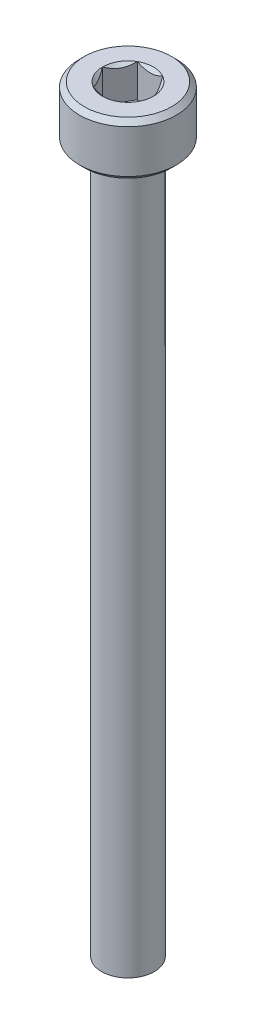
ISO-10303-21;
HEADER;
FILE_DESCRIPTION(('STEP AP214'),'2;1');
FILE_NAME('part.step','',(''),(''),'','','');
FILE_SCHEMA(('AUTOMOTIVE_DESIGN { 1 0 10303 214 1 1 1 1 }'));
ENDSEC;
DATA;
#1=APPLICATION_CONTEXT('core data for automotive mechanical design processes');
#2=APPLICATION_PROTOCOL_DEFINITION('international standard','automotive_design',2000,#1);
#3=PRODUCT_CONTEXT('',#1,'mechanical');
#4=PRODUCT('Part','Part','',(#3));
#5=PRODUCT_RELATED_PRODUCT_CATEGORY('part','',(#4));
#6=PRODUCT_DEFINITION_FORMATION('','',#4);
#7=PRODUCT_DEFINITION_CONTEXT('part definition',#1,'design');
#8=PRODUCT_DEFINITION('design','',#6,#7);
#9=PRODUCT_DEFINITION_SHAPE('','',#8);
#10=(LENGTH_UNIT() NAMED_UNIT(*) SI_UNIT(.MILLI.,.METRE.));
#11=(NAMED_UNIT(*) PLANE_ANGLE_UNIT() SI_UNIT($,.RADIAN.));
#12=(NAMED_UNIT(*) SI_UNIT($,.STERADIAN.) SOLID_ANGLE_UNIT());
#13=UNCERTAINTY_MEASURE_WITH_UNIT(LENGTH_MEASURE(1.E-05),#10,'distance_accuracy_value','');
#14=(GEOMETRIC_REPRESENTATION_CONTEXT(3) GLOBAL_UNCERTAINTY_ASSIGNED_CONTEXT((#13)) GLOBAL_UNIT_ASSIGNED_CONTEXT((#10,
#11,#12)) REPRESENTATION_CONTEXT('',''));
#15=CARTESIAN_POINT('',(0.,0.,0.));
#16=DIRECTION('',(0.,0.,1.));
#17=DIRECTION('',(1.,0.,0.));
#18=AXIS2_PLACEMENT_3D('',#15,#16,#17);
#19=CARTESIAN_POINT('',(0.,3.,0.));
#20=DIRECTION('',(0.,-1.,0.));
#21=DIRECTION('',(0.,0.,-1.));
#22=AXIS2_PLACEMENT_3D('',#19,#20,#21);
#23=CYLINDRICAL_SURFACE('',#22,2.75);
#24=CARTESIAN_POINT('',(0.,0.275000000000001,0.));
#25=DIRECTION('',(0.,1.,0.));
#26=DIRECTION('',(0.,0.,1.));
#27=AXIS2_PLACEMENT_3D('',#24,#25,#26);
#28=CIRCLE('',#27,2.75);
#29=CARTESIAN_POINT('',(0.,0.275000000000001,2.75));
#30=VERTEX_POINT('',#29);
#31=EDGE_CURVE('E232',#30,#30,#28,.T.);
#32=ORIENTED_EDGE('',*,*,#31,.T.);
#33=EDGE_LOOP('',(#32));
#34=FACE_BOUND('',#33,.T.);
#35=CARTESIAN_POINT('',(0.,2.725,0.));
#36=DIRECTION('',(0.,1.,0.));
#37=DIRECTION('',(0.,0.,1.));
#38=AXIS2_PLACEMENT_3D('',#35,#36,#37);
#39=CIRCLE('',#38,2.75);
#40=CARTESIAN_POINT('',(0.,2.725,2.75));
#41=VERTEX_POINT('',#40);
#42=EDGE_CURVE('E109',#41,#41,#39,.F.);
#43=ORIENTED_EDGE('',*,*,#42,.T.);
#44=EDGE_LOOP('',(#43));
#45=FACE_BOUND('',#44,.T.);
#46=ADVANCED_FACE('F37',(#34,#45),#23,.T.);
#47=CARTESIAN_POINT('',(0.,3.,0.));
#48=DIRECTION('',(0.,1.,0.));
#49=DIRECTION('',(0.,0.,1.));
#50=AXIS2_PLACEMENT_3D('',#47,#48,#49);
#51=PLANE('',#50);
#52=CARTESIAN_POINT('',(0.,3.,0.));
#53=DIRECTION('',(0.,1.,0.));
#54=DIRECTION('',(0.,0.,1.));
#55=AXIS2_PLACEMENT_3D('',#52,#53,#54);
#56=CIRCLE('',#55,2.475);
#57=CARTESIAN_POINT('',(0.,3.,2.475));
#58=VERTEX_POINT('',#57);
#59=EDGE_CURVE('E41',#58,#58,#56,.T.);
#60=ORIENTED_EDGE('',*,*,#59,.T.);
#61=EDGE_LOOP('',(#60));
#62=FACE_BOUND('',#61,.T.);
#63=CARTESIAN_POINT('',(0.,3.,0.));
#64=DIRECTION('',(0.,1.,0.));
#65=DIRECTION('',(0.,0.,1.));
#66=AXIS2_PLACEMENT_3D('',#63,#64,#65);
#67=CIRCLE('',#66,1.44337567297406);
#68=CARTESIAN_POINT('',(0.721687836487033,3.,1.25));
#69=VERTEX_POINT('',#68);
#70=CARTESIAN_POINT('',(1.44337567297406,3.,0.));
#71=VERTEX_POINT('',#70);
#72=EDGE_CURVE('E52',#69,#71,#67,.T.);
#73=ORIENTED_EDGE('',*,*,#72,.F.);
#74=CARTESIAN_POINT('',(-0.721687836487033,3.,1.25));
#75=VERTEX_POINT('',#74);
#76=EDGE_CURVE('E59',#75,#69,#67,.T.);
#77=ORIENTED_EDGE('',*,*,#76,.F.);
#78=CARTESIAN_POINT('',(-1.44337567297406,3.,0.));
#79=VERTEX_POINT('',#78);
#80=EDGE_CURVE('E132',#79,#75,#67,.T.);
#81=ORIENTED_EDGE('',*,*,#80,.F.);
#82=CARTESIAN_POINT('',(-0.721687836487033,3.,-1.25));
#83=VERTEX_POINT('',#82);
#84=EDGE_CURVE('E131',#83,#79,#67,.T.);
#85=ORIENTED_EDGE('',*,*,#84,.F.);
#86=CARTESIAN_POINT('',(0.721687836487032,3.,-1.25));
#87=VERTEX_POINT('',#86);
#88=EDGE_CURVE('E99',#87,#83,#67,.T.);
#89=ORIENTED_EDGE('',*,*,#88,.F.);
#90=EDGE_CURVE('E91',#71,#87,#67,.T.);
#91=ORIENTED_EDGE('',*,*,#90,.F.);
#92=EDGE_LOOP('',(#73,#77,#81,#85,#89,#91));
#93=FACE_BOUND('',#92,.T.);
#94=ADVANCED_FACE('F129',(#62,#93),#51,.T.);
#95=CARTESIAN_POINT('',(0.,0.,0.));
#96=DIRECTION('',(0.,1.,0.));
#97=DIRECTION('',(0.,0.,1.));
#98=AXIS2_PLACEMENT_3D('',#95,#96,#97);
#99=PLANE('',#98);
#100=CARTESIAN_POINT('',(0.,0.,0.));
#101=DIRECTION('',(0.,-1.,0.));
#102=DIRECTION('',(0.,0.,-1.));
#103=AXIS2_PLACEMENT_3D('',#100,#101,#102);
#104=CIRCLE('',#103,1.5);
#105=CARTESIAN_POINT('',(0.,0.,-1.5));
#106=VERTEX_POINT('',#105);
#107=EDGE_CURVE('E11',#106,#106,#104,.T.);
#108=ORIENTED_EDGE('',*,*,#107,.F.);
#109=EDGE_LOOP('',(#108));
#110=FACE_BOUND('',#109,.T.);
#111=CARTESIAN_POINT('',(0.,0.,0.));
#112=DIRECTION('',(0.,1.,0.));
#113=DIRECTION('',(0.,0.,1.));
#114=AXIS2_PLACEMENT_3D('',#111,#112,#113);
#115=CIRCLE('',#114,2.475);
#116=CARTESIAN_POINT('',(0.,0.,2.475));
#117=VERTEX_POINT('',#116);
#118=EDGE_CURVE('E230',#117,#117,#115,.F.);
#119=ORIENTED_EDGE('',*,*,#118,.T.);
#120=EDGE_LOOP('',(#119));
#121=FACE_BOUND('',#120,.T.);
#122=ADVANCED_FACE('F213',(#110,#121),#99,.F.);
#123=CARTESIAN_POINT('',(0.,3.,0.));
#124=DIRECTION('',(0.,1.,0.));
#125=DIRECTION('',(0.,0.,1.));
#126=AXIS2_PLACEMENT_3D('',#123,#124,#125);
#127=CONICAL_SURFACE('',#126,1.44337567297406,0.78539816339745);
#128=ORIENTED_EDGE('',*,*,#88,.T.);
#129=CARTESIAN_POINT('',(-1.43934010808077,3.46298209689233,-1.25));
#130=CARTESIAN_POINT('',(-1.40429313005659,3.43652492263289,-1.25));
#131=CARTESIAN_POINT('',(-1.36905087135599,3.41032716035428,-1.25));
#132=CARTESIAN_POINT('',(-1.29809650706311,3.35855757183958,-1.25));
#133=CARTESIAN_POINT('',(-1.26238428576495,3.33298590435629,-1.25));
#134=CARTESIAN_POINT('',(-1.15390111792708,3.25700599368946,-1.25));
#135=CARTESIAN_POINT('',(-1.08031646726264,3.20774028618957,-1.25));
#136=CARTESIAN_POINT('',(-0.926012322755095,3.11102583026313,-1.25));
#137=CARTESIAN_POINT('',(-0.845125318656146,3.0638412989418,-1.25));
#138=CARTESIAN_POINT('',(-0.679311174076602,2.97753073439041,-1.25));
#139=CARTESIAN_POINT('',(-0.594398891026688,2.9383775346269,-1.25));
#140=CARTESIAN_POINT('',(-0.466944812460741,2.89047722368829,-1.25));
#141=CARTESIAN_POINT('',(-0.426289985812822,2.87672948978634,-1.25));
#142=CARTESIAN_POINT('',(-0.343998850091268,2.85249792745054,-1.25));
#143=CARTESIAN_POINT('',(-0.302362473614962,2.84201432386977,-1.25));
#144=CARTESIAN_POINT('',(-0.219052696285666,2.8250301617483,-1.25));
#145=CARTESIAN_POINT('',(-0.1773934284745,2.81846136047137,-1.25));
#146=CARTESIAN_POINT('',(-0.0936293693401924,2.80943505345776,-1.25));
#147=CARTESIAN_POINT('',(-0.0515246558543963,2.80697684099727,-1.25));
#148=CARTESIAN_POINT('',(0.0311890576306314,2.80635406201328,-1.25));
#149=CARTESIAN_POINT('',(0.0717969625499302,2.80803711684625,-1.25));
#150=CARTESIAN_POINT('',(0.152668636885197,2.81526827059791,-1.25));
#151=CARTESIAN_POINT('',(0.192932338835358,2.82081711041311,-1.25));
#152=CARTESIAN_POINT('',(0.273499879165295,2.83557103646495,-1.25));
#153=CARTESIAN_POINT('',(0.313792180618511,2.8448381759641,-1.25));
#154=CARTESIAN_POINT('',(0.393496413911457,2.86653617845735,-1.25));
#155=CARTESIAN_POINT('',(0.432908419115059,2.87896677673064,-1.25));
#156=CARTESIAN_POINT('',(0.556992735862298,2.92277935293144,-1.25));
#157=CARTESIAN_POINT('',(0.639898924666085,2.95915107287596,-1.25));
#158=CARTESIAN_POINT('',(0.801816555499701,3.04001916217833,-1.25));
#159=CARTESIAN_POINT('',(0.880812666325045,3.08454472091199,-1.25));
#160=CARTESIAN_POINT('',(1.0317856127975,3.17640487666662,-1.25));
#161=CARTESIAN_POINT('',(1.10391618485086,3.22348993391625,-1.25));
#162=CARTESIAN_POINT('',(1.21018606043311,3.29627856159854,-1.25));
#163=CARTESIAN_POINT('',(1.24515069969379,3.32079808539336,-1.25));
#164=CARTESIAN_POINT('',(1.31460220852736,3.37048563676568,-1.25));
#165=CARTESIAN_POINT('',(1.34908920596618,3.39565348541552,-1.25));
#166=CARTESIAN_POINT('',(1.38337731682912,3.42109014884121,-1.25));
#167=B_SPLINE_CURVE_WITH_KNOTS('',3,(#129,#130,#131,#132,#133,#134,#135,#136,#137,#138,#139,
#140,#141,#142,#143,#144,#145,#146,#147,#148,#149,#150,#151,#152,#153,#154,#155,#156,#157,#158,
#159,#160,#161,#162,#163,#164,#165,#166),.UNSPECIFIED.,.F.,.F.,(4,2,2,2,2,2,2,2,2,2,2,2,2,2,2,2,
2,2,4),(0.,0.131732960381448,0.263498984161645,0.529042014455825,0.809741926134617,
1.08947609717225,1.21811634272576,1.346765447839,1.47310084517844,1.59941451973784,
1.72115042167849,1.84290966131735,1.96679153905341,2.09066305366039,2.36146692896009,
2.63325989198491,2.89154668212279,3.01965734507713,3.14773302245628),.UNSPECIFIED.);
#168=EDGE_CURVE('E104',#87,#83,#167,.F.);
#169=ORIENTED_EDGE('',*,*,#168,.F.);
#170=EDGE_LOOP('',(#128,#169));
#171=FACE_BOUND('',#170,.T.);
#172=ADVANCED_FACE('F105',(#171),#127,.F.);
#173=ORIENTED_EDGE('',*,*,#84,.T.);
#174=CARTESIAN_POINT('',(-0.721572366433195,3.00011548390914,-1.2502));
#175=CARTESIAN_POINT('',(-0.746384090710444,2.9753216680551,-1.20722483292841));
#176=CARTESIAN_POINT('',(-0.771610739653664,2.95198373441868,-1.16353099525405));
#177=CARTESIAN_POINT('',(-0.823050873919155,2.90925200408454,-1.07443406915806));
#178=CARTESIAN_POINT('',(-0.849269254648333,2.88988199236041,-1.02902250164294));
#179=CARTESIAN_POINT('',(-0.902137405038635,2.85670048341348,-0.937452179064741));
#180=CARTESIAN_POINT('',(-0.928773701756387,2.84280555905266,-0.891316759824115));
#181=CARTESIAN_POINT('',(-0.982632884076012,2.82139728216064,-0.798029919592408));
#182=CARTESIAN_POINT('',(-1.00985412292348,2.81386794156679,-0.750881350863621));
#183=CARTESIAN_POINT('',(-1.05676666578643,2.8070744980507,-0.669626443112748));
#184=CARTESIAN_POINT('',(-1.07639733689152,2.80606855910435,-0.63562512337206));
#185=CARTESIAN_POINT('',(-1.11562418145499,2.80776141491132,-0.567682235567523));
#186=CARTESIAN_POINT('',(-1.1352203463451,2.81046102721554,-0.533740682344343));
#187=CARTESIAN_POINT('',(-1.1742235548576,2.81940893031638,-0.466185143542501));
#188=CARTESIAN_POINT('',(-1.19363040521233,2.82566052589971,-0.432571492713226));
#189=CARTESIAN_POINT('',(-1.23212011385119,2.8413756814139,-0.365905361782188));
#190=CARTESIAN_POINT('',(-1.2512028293628,2.85084062008746,-0.332853128969705));
#191=CARTESIAN_POINT('',(-1.30007715810653,2.87893139068759,-0.248200308399736));
#192=CARTESIAN_POINT('',(-1.32956058931202,2.8996701574522,-0.197133507570362));
#193=CARTESIAN_POINT('',(-1.38737318998519,2.94638713467148,-0.0969991458867452));
#194=CARTESIAN_POINT('',(-1.41570576386268,2.97234829594677,-0.0479256884217304));
#195=CARTESIAN_POINT('',(-1.4434911430279,3.00011548390914,0.000200000000000358));
#196=B_SPLINE_CURVE_WITH_KNOTS('',3,(#174,#175,#176,#177,#178,#179,#180,#181,#182,#183,#184,
#185,#186,#187,#188,#189,#190,#191,#192,#193,#194,#195),.UNSPECIFIED.,.F.,.F.,(4,2,2,2,2,2,2,2,
2,2,4),(0.,0.166533409618303,0.334037607289761,0.498880396489697,0.663307919240274,
0.780963963458826,0.898645970148452,1.01643764860773,1.13427993171549,1.32148652032141,
1.50809158792574),.UNSPECIFIED.);
#197=EDGE_CURVE('E134',#83,#79,#196,.T.);
#198=ORIENTED_EDGE('',*,*,#197,.F.);
#199=EDGE_LOOP('',(#173,#198));
#200=FACE_BOUND('',#199,.T.);
#201=ADVANCED_FACE('F245',(#200),#127,.F.);
#202=ORIENTED_EDGE('',*,*,#80,.T.);
#203=CARTESIAN_POINT('',(-1.4434911430279,3.00011548390914,-0.000199999999999785));
#204=CARTESIAN_POINT('',(-1.41867941875065,2.9753216680551,0.0427751670715869));
#205=CARTESIAN_POINT('',(-1.39345276980743,2.95198373441868,0.0864690047459481));
#206=CARTESIAN_POINT('',(-1.34201263554194,2.90925200408454,0.175565930841942));
#207=CARTESIAN_POINT('',(-1.31579425481276,2.88988199236041,0.220977498357064));
#208=CARTESIAN_POINT('',(-1.26292610442246,2.85670048341348,0.31254782093526));
#209=CARTESIAN_POINT('',(-1.23628980770471,2.84280555905266,0.358683240175886));
#210=CARTESIAN_POINT('',(-1.18243062538508,2.82139728216064,0.451970080407593));
#211=CARTESIAN_POINT('',(-1.15520938653761,2.81386794156679,0.49911864913638));
#212=CARTESIAN_POINT('',(-1.10829684367467,2.8070744980507,0.580373556887253));
#213=CARTESIAN_POINT('',(-1.08866617256958,2.80606855910435,0.614374876627941));
#214=CARTESIAN_POINT('',(-1.04943932800611,2.80776141491132,0.682317764432478));
#215=CARTESIAN_POINT('',(-1.02984316311599,2.81046102721554,0.716259317655658));
#216=CARTESIAN_POINT('',(-0.990839954603499,2.81940893031638,0.7838148564575));
#217=CARTESIAN_POINT('',(-0.971433104248771,2.82566052589971,0.817428507286775));
#218=CARTESIAN_POINT('',(-0.932943395609905,2.8413756814139,0.884094638217813));
#219=CARTESIAN_POINT('',(-0.9138606800983,2.85084062008746,0.917146871030296));
#220=CARTESIAN_POINT('',(-0.864986351354568,2.87893139068759,1.00179969160026));
#221=CARTESIAN_POINT('',(-0.835502920149076,2.8996701574522,1.05286649242964));
#222=CARTESIAN_POINT('',(-0.777690319475909,2.94638713467148,1.15300085411325));
#223=CARTESIAN_POINT('',(-0.749357745598417,2.97234829594677,1.20207431157827));
#224=CARTESIAN_POINT('',(-0.721572366433195,3.00011548390914,1.2502));
#225=B_SPLINE_CURVE_WITH_KNOTS('',3,(#203,#204,#205,#206,#207,#208,#209,#210,#211,#212,#213,
#214,#215,#216,#217,#218,#219,#220,#221,#222,#223,#224),.UNSPECIFIED.,.F.,.F.,(4,2,2,2,2,2,2,2,
2,2,4),(0.,0.166533409618303,0.334037607289761,0.498880396489698,0.663307919240275,
0.780963963458827,0.898645970148453,1.01643764860773,1.1342799317155,1.32148652032141,
1.50809158792573),.UNSPECIFIED.);
#226=EDGE_CURVE('E144',#79,#75,#225,.T.);
#227=ORIENTED_EDGE('',*,*,#226,.F.);
#228=EDGE_LOOP('',(#202,#227));
#229=FACE_BOUND('',#228,.T.);
#230=ADVANCED_FACE('F261',(#229),#127,.F.);
#231=ORIENTED_EDGE('',*,*,#76,.T.);
#232=CARTESIAN_POINT('',(-1.43934010808077,3.46298209689233,1.25));
#233=CARTESIAN_POINT('',(-1.40429313005659,3.43652492263289,1.25));
#234=CARTESIAN_POINT('',(-1.36905087135599,3.41032716035428,1.25));
#235=CARTESIAN_POINT('',(-1.29809650706311,3.35855757183958,1.25));
#236=CARTESIAN_POINT('',(-1.26238428576495,3.33298590435629,1.25));
#237=CARTESIAN_POINT('',(-1.15390111792708,3.25700599368946,1.25));
#238=CARTESIAN_POINT('',(-1.08031646726264,3.20774028618957,1.25));
#239=CARTESIAN_POINT('',(-0.926012322755096,3.11102583026313,1.25));
#240=CARTESIAN_POINT('',(-0.845125318656147,3.0638412989418,1.25));
#241=CARTESIAN_POINT('',(-0.679311174076603,2.97753073439041,1.25));
#242=CARTESIAN_POINT('',(-0.594398891026688,2.9383775346269,1.25));
#243=CARTESIAN_POINT('',(-0.46694481246074,2.89047722368829,1.25));
#244=CARTESIAN_POINT('',(-0.426289985812822,2.87672948978634,1.25));
#245=CARTESIAN_POINT('',(-0.343998850091268,2.85249792745054,1.25));
#246=CARTESIAN_POINT('',(-0.302362473614962,2.84201432386977,1.25));
#247=CARTESIAN_POINT('',(-0.219052696285665,2.8250301617483,1.25));
#248=CARTESIAN_POINT('',(-0.1773934284745,2.81846136047137,1.25));
#249=CARTESIAN_POINT('',(-0.0936293693401921,2.80943505345776,1.25));
#250=CARTESIAN_POINT('',(-0.051524655854396,2.80697684099727,1.25));
#251=CARTESIAN_POINT('',(0.0311890576306315,2.80635406201328,1.25));
#252=CARTESIAN_POINT('',(0.0717969625499303,2.80803711684625,1.25));
#253=CARTESIAN_POINT('',(0.152668636885197,2.81526827059791,1.25));
#254=CARTESIAN_POINT('',(0.192932338835358,2.82081711041311,1.25));
#255=CARTESIAN_POINT('',(0.273499879165295,2.83557103646495,1.25));
#256=CARTESIAN_POINT('',(0.313792180618511,2.8448381759641,1.25));
#257=CARTESIAN_POINT('',(0.393496413911457,2.86653617845735,1.25));
#258=CARTESIAN_POINT('',(0.432908419115059,2.87896677673064,1.25));
#259=CARTESIAN_POINT('',(0.556992735862298,2.92277935293144,1.25));
#260=CARTESIAN_POINT('',(0.639898924666085,2.95915107287595,1.25));
#261=CARTESIAN_POINT('',(0.801816555499701,3.04001916217833,1.25));
#262=CARTESIAN_POINT('',(0.880812666325044,3.08454472091198,1.25));
#263=CARTESIAN_POINT('',(1.0317856127975,3.17640487666662,1.25));
#264=CARTESIAN_POINT('',(1.10391618485086,3.22348993391625,1.25));
#265=CARTESIAN_POINT('',(1.2101860604331,3.29627856159854,1.25));
#266=CARTESIAN_POINT('',(1.24515069969379,3.32079808539336,1.25));
#267=CARTESIAN_POINT('',(1.31460220852736,3.37048563676568,1.25));
#268=CARTESIAN_POINT('',(1.34908920596618,3.39565348541552,1.25));
#269=CARTESIAN_POINT('',(1.38337731682911,3.42109014884121,1.25));
#270=B_SPLINE_CURVE_WITH_KNOTS('',3,(#232,#233,#234,#235,#236,#237,#238,#239,#240,#241,#242,
#243,#244,#245,#246,#247,#248,#249,#250,#251,#252,#253,#254,#255,#256,#257,#258,#259,#260,#261,
#262,#263,#264,#265,#266,#267,#268,#269),.UNSPECIFIED.,.F.,.F.,(4,2,2,2,2,2,2,2,2,2,2,2,2,2,2,2,
2,2,4),(0.,0.131732960381448,0.263498984161645,0.529042014455826,0.809741926134619,
1.08947609717225,1.21811634272577,1.34676544783901,1.47310084517844,1.59941451973785,
1.7211504216785,1.84290966131735,1.96679153905342,2.09066305366039,2.36146692896009,
2.63325989198491,2.89154668212279,3.01965734507713,3.14773302245628),.UNSPECIFIED.);
#271=EDGE_CURVE('E173',#75,#69,#270,.T.);
#272=ORIENTED_EDGE('',*,*,#271,.F.);
#273=EDGE_LOOP('',(#231,#272));
#274=FACE_BOUND('',#273,.T.);
#275=ADVANCED_FACE('F291',(#274),#127,.F.);
#276=ORIENTED_EDGE('',*,*,#72,.T.);
#277=CARTESIAN_POINT('',(0.721572366433194,3.00011548390914,1.2502));
#278=CARTESIAN_POINT('',(0.746384090710444,2.9753216680551,1.20722483292841));
#279=CARTESIAN_POINT('',(0.771610739653664,2.95198373441868,1.16353099525405));
#280=CARTESIAN_POINT('',(0.823050873919154,2.90925200408454,1.07443406915806));
#281=CARTESIAN_POINT('',(0.849269254648333,2.88988199236041,1.02902250164294));
#282=CARTESIAN_POINT('',(0.902137405038635,2.85670048341348,0.93745217906474));
#283=CARTESIAN_POINT('',(0.928773701756386,2.84280555905266,0.891316759824115));
#284=CARTESIAN_POINT('',(0.982632884076012,2.82139728216064,0.798029919592408));
#285=CARTESIAN_POINT('',(1.00985412292348,2.81386794156679,0.750881350863621));
#286=CARTESIAN_POINT('',(1.05676666578643,2.8070744980507,0.669626443112748));
#287=CARTESIAN_POINT('',(1.07639733689152,2.80606855910435,0.63562512337206));
#288=CARTESIAN_POINT('',(1.11562418145499,2.80776141491132,0.567682235567523));
#289=CARTESIAN_POINT('',(1.1352203463451,2.81046102721554,0.533740682344343));
#290=CARTESIAN_POINT('',(1.1742235548576,2.81940893031638,0.466185143542501));
#291=CARTESIAN_POINT('',(1.19363040521232,2.8256605258997,0.432571492713226));
#292=CARTESIAN_POINT('',(1.23212011385119,2.8413756814139,0.365905361782188));
#293=CARTESIAN_POINT('',(1.2512028293628,2.85084062008746,0.332853128969705));
#294=CARTESIAN_POINT('',(1.30007715810653,2.87893139068759,0.248200308399736));
#295=CARTESIAN_POINT('',(1.32956058931202,2.8996701574522,0.197133507570362));
#296=CARTESIAN_POINT('',(1.38737318998519,2.94638713467148,0.096999145886745));
#297=CARTESIAN_POINT('',(1.41570576386268,2.97234829594677,0.04792568842173));
#298=CARTESIAN_POINT('',(1.4434911430279,3.00011548390914,-0.000200000000000782));
#299=B_SPLINE_CURVE_WITH_KNOTS('',3,(#277,#278,#279,#280,#281,#282,#283,#284,#285,#286,#287,
#288,#289,#290,#291,#292,#293,#294,#295,#296,#297,#298),.UNSPECIFIED.,.F.,.F.,(4,2,2,2,2,2,2,2,
2,2,4),(0.,0.166533409618303,0.334037607289761,0.498880396489697,0.663307919240274,
0.780963963458826,0.898645970148452,1.01643764860773,1.13427993171549,1.32148652032141,
1.50809158792574),.UNSPECIFIED.);
#300=EDGE_CURVE('E119',#69,#71,#299,.T.);
#301=ORIENTED_EDGE('',*,*,#300,.F.);
#302=EDGE_LOOP('',(#276,#301));
#303=FACE_BOUND('',#302,.T.);
#304=ADVANCED_FACE('F159',(#303),#127,.F.);
#305=ORIENTED_EDGE('',*,*,#90,.T.);
#306=CARTESIAN_POINT('',(1.4434911430279,3.00011548390914,0.000199999999999333));
#307=CARTESIAN_POINT('',(1.41867941875065,2.9753216680551,-0.0427751670715874));
#308=CARTESIAN_POINT('',(1.39345276980743,2.95198373441868,-0.0864690047459486));
#309=CARTESIAN_POINT('',(1.34201263554194,2.90925200408454,-0.175565930841942));
#310=CARTESIAN_POINT('',(1.31579425481276,2.88988199236041,-0.220977498357064));
#311=CARTESIAN_POINT('',(1.26292610442246,2.85670048341348,-0.31254782093526));
#312=CARTESIAN_POINT('',(1.23628980770471,2.84280555905266,-0.358683240175886));
#313=CARTESIAN_POINT('',(1.18243062538508,2.82139728216064,-0.451970080407593));
#314=CARTESIAN_POINT('',(1.15520938653761,2.81386794156679,-0.49911864913638));
#315=CARTESIAN_POINT('',(1.10829684367467,2.8070744980507,-0.580373556887252));
#316=CARTESIAN_POINT('',(1.08866617256958,2.80606855910435,-0.614374876627941));
#317=CARTESIAN_POINT('',(1.04943932800611,2.80776141491132,-0.682317764432477));
#318=CARTESIAN_POINT('',(1.02984316311599,2.81046102721554,-0.716259317655657));
#319=CARTESIAN_POINT('',(0.990839954603499,2.81940893031638,-0.783814856457499));
#320=CARTESIAN_POINT('',(0.971433104248771,2.82566052589971,-0.817428507286775));
#321=CARTESIAN_POINT('',(0.932943395609905,2.8413756814139,-0.884094638217813));
#322=CARTESIAN_POINT('',(0.9138606800983,2.85084062008746,-0.917146871030295));
#323=CARTESIAN_POINT('',(0.864986351354567,2.87893139068759,-1.00179969160026));
#324=CARTESIAN_POINT('',(0.835502920149075,2.8996701574522,-1.05286649242964));
#325=CARTESIAN_POINT('',(0.777690319475908,2.94638713467148,-1.15300085411326));
#326=CARTESIAN_POINT('',(0.749357745598416,2.97234829594677,-1.20207431157827));
#327=CARTESIAN_POINT('',(0.721572366433194,3.00011548390914,-1.2502));
#328=B_SPLINE_CURVE_WITH_KNOTS('',3,(#306,#307,#308,#309,#310,#311,#312,#313,#314,#315,#316,
#317,#318,#319,#320,#321,#322,#323,#324,#325,#326,#327),.UNSPECIFIED.,.F.,.F.,(4,2,2,2,2,2,2,2,
2,2,4),(0.,0.166533409618303,0.334037607289761,0.498880396489698,0.663307919240274,
0.780963963458826,0.898645970148452,1.01643764860773,1.13427993171549,1.32148652032141,
1.50809158792574),.UNSPECIFIED.);
#329=EDGE_CURVE('E95',#71,#87,#328,.T.);
#330=ORIENTED_EDGE('',*,*,#329,.F.);
#331=EDGE_LOOP('',(#305,#330));
#332=FACE_BOUND('',#331,.T.);
#333=ADVANCED_FACE('F93',(#332),#127,.F.);
#334=CARTESIAN_POINT('',(0.,1.12,0.));
#335=DIRECTION('',(0.,1.,0.));
#336=DIRECTION('',(0.,0.,1.));
#337=AXIS2_PLACEMENT_3D('',#334,#335,#336);
#338=PLANE('',#337);
#339=DIRECTION('',(-0.5,0.,-0.866025403784438));
#340=VECTOR('',#339,1.);
#341=CARTESIAN_POINT('',(1.44337567297406,1.12,0.));
#342=LINE('',#341,#340);
#343=CARTESIAN_POINT('',(1.44337567297406,1.12,0.));
#344=VERTEX_POINT('',#343);
#345=CARTESIAN_POINT('',(0.721687836487032,1.12,-1.25));
#346=VERTEX_POINT('',#345);
#347=EDGE_CURVE('E118',#344,#346,#342,.T.);
#348=ORIENTED_EDGE('',*,*,#347,.T.);
#349=DIRECTION('',(-1.,0.,0.));
#350=VECTOR('',#349,1.);
#351=CARTESIAN_POINT('',(0.721687836487032,1.12,-1.25));
#352=LINE('',#351,#350);
#353=CARTESIAN_POINT('',(-0.721687836487032,1.12,-1.25));
#354=VERTEX_POINT('',#353);
#355=EDGE_CURVE('E123',#346,#354,#352,.T.);
#356=ORIENTED_EDGE('',*,*,#355,.T.);
#357=DIRECTION('',(-0.5,0.,0.866025403784439));
#358=VECTOR('',#357,1.);
#359=CARTESIAN_POINT('',(-0.721687836487032,1.12,-1.25));
#360=LINE('',#359,#358);
#361=CARTESIAN_POINT('',(-1.44337567297406,1.12,0.));
#362=VERTEX_POINT('',#361);
#363=EDGE_CURVE('E285',#354,#362,#360,.T.);
#364=ORIENTED_EDGE('',*,*,#363,.T.);
#365=DIRECTION('',(0.5,0.,0.866025403784439));
#366=VECTOR('',#365,1.);
#367=CARTESIAN_POINT('',(-1.44337567297406,1.12,0.));
#368=LINE('',#367,#366);
#369=CARTESIAN_POINT('',(-0.721687836487033,1.12,1.25));
#370=VERTEX_POINT('',#369);
#371=EDGE_CURVE('E268',#362,#370,#368,.T.);
#372=ORIENTED_EDGE('',*,*,#371,.T.);
#373=DIRECTION('',(1.,0.,0.));
#374=VECTOR('',#373,1.);
#375=CARTESIAN_POINT('',(-0.721687836487033,1.12,1.25));
#376=LINE('',#375,#374);
#377=CARTESIAN_POINT('',(0.721687836487032,1.12,1.25));
#378=VERTEX_POINT('',#377);
#379=EDGE_CURVE('E281',#370,#378,#376,.T.);
#380=ORIENTED_EDGE('',*,*,#379,.T.);
#381=DIRECTION('',(0.5,0.,-0.866025403784439));
#382=VECTOR('',#381,1.);
#383=CARTESIAN_POINT('',(0.721687836487032,1.12,1.25));
#384=LINE('',#383,#382);
#385=EDGE_CURVE('E126',#378,#344,#384,.T.);
#386=ORIENTED_EDGE('',*,*,#385,.T.);
#387=EDGE_LOOP('',(#348,#356,#364,#372,#380,#386));
#388=FACE_BOUND('',#387,.T.);
#389=ADVANCED_FACE('F158',(#388),#338,.T.);
#390=CARTESIAN_POINT('',(0.721687836487032,1.12,-1.25));
#391=DIRECTION('',(0.,0.,-1.));
#392=DIRECTION('',(-1.,0.,0.));
#393=AXIS2_PLACEMENT_3D('',#390,#391,#392);
#394=PLANE('',#393);
#395=DIRECTION('',(0.,1.,0.));
#396=VECTOR('',#395,1.);
#397=CARTESIAN_POINT('',(0.721687836487032,1.12,-1.25));
#398=LINE('',#397,#396);
#399=EDGE_CURVE('E116',#346,#87,#398,.T.);
#400=ORIENTED_EDGE('',*,*,#399,.T.);
#401=ORIENTED_EDGE('',*,*,#168,.T.);
#402=DIRECTION('',(0.,1.,0.));
#403=VECTOR('',#402,1.);
#404=CARTESIAN_POINT('',(-0.721687836487032,1.12,-1.25));
#405=LINE('',#404,#403);
#406=EDGE_CURVE('E125',#354,#83,#405,.T.);
#407=ORIENTED_EDGE('',*,*,#406,.F.);
#408=ORIENTED_EDGE('',*,*,#355,.F.);
#409=EDGE_LOOP('',(#400,#401,#407,#408));
#410=FACE_BOUND('',#409,.T.);
#411=ADVANCED_FACE('F121',(#410),#394,.F.);
#412=CARTESIAN_POINT('',(-0.721687836487032,1.12,-1.25));
#413=DIRECTION('',(-0.866025403784439,0.,-0.5));
#414=DIRECTION('',(-0.5,0.,0.866025403784439));
#415=AXIS2_PLACEMENT_3D('',#412,#413,#414);
#416=PLANE('',#415);
#417=ORIENTED_EDGE('',*,*,#406,.T.);
#418=ORIENTED_EDGE('',*,*,#197,.T.);
#419=DIRECTION('',(0.,1.,0.));
#420=VECTOR('',#419,1.);
#421=CARTESIAN_POINT('',(-1.44337567297406,1.12,0.));
#422=LINE('',#421,#420);
#423=EDGE_CURVE('E264',#362,#79,#422,.T.);
#424=ORIENTED_EDGE('',*,*,#423,.F.);
#425=ORIENTED_EDGE('',*,*,#363,.F.);
#426=EDGE_LOOP('',(#417,#418,#424,#425));
#427=FACE_BOUND('',#426,.T.);
#428=ADVANCED_FACE('F151',(#427),#416,.F.);
#429=CARTESIAN_POINT('',(-1.44337567297406,1.12,0.));
#430=DIRECTION('',(-0.866025403784439,0.,0.5));
#431=DIRECTION('',(0.5,0.,0.866025403784439));
#432=AXIS2_PLACEMENT_3D('',#429,#430,#431);
#433=PLANE('',#432);
#434=ORIENTED_EDGE('',*,*,#423,.T.);
#435=ORIENTED_EDGE('',*,*,#226,.T.);
#436=DIRECTION('',(0.,1.,0.));
#437=VECTOR('',#436,1.);
#438=CARTESIAN_POINT('',(-0.721687836487033,1.12,1.25));
#439=LINE('',#438,#437);
#440=EDGE_CURVE('E270',#370,#75,#439,.T.);
#441=ORIENTED_EDGE('',*,*,#440,.F.);
#442=ORIENTED_EDGE('',*,*,#371,.F.);
#443=EDGE_LOOP('',(#434,#435,#441,#442));
#444=FACE_BOUND('',#443,.T.);
#445=ADVANCED_FACE('F197',(#444),#433,.F.);
#446=CARTESIAN_POINT('',(-0.721687836487033,1.12,1.25));
#447=DIRECTION('',(0.,0.,1.));
#448=DIRECTION('',(1.,0.,0.));
#449=AXIS2_PLACEMENT_3D('',#446,#447,#448);
#450=PLANE('',#449);
#451=ORIENTED_EDGE('',*,*,#440,.T.);
#452=ORIENTED_EDGE('',*,*,#271,.T.);
#453=DIRECTION('',(0.,1.,0.));
#454=VECTOR('',#453,1.);
#455=CARTESIAN_POINT('',(0.721687836487032,1.12,1.25));
#456=LINE('',#455,#454);
#457=EDGE_CURVE('E272',#378,#69,#456,.T.);
#458=ORIENTED_EDGE('',*,*,#457,.F.);
#459=ORIENTED_EDGE('',*,*,#379,.F.);
#460=EDGE_LOOP('',(#451,#452,#458,#459));
#461=FACE_BOUND('',#460,.T.);
#462=ADVANCED_FACE('F193',(#461),#450,.F.);
#463=CARTESIAN_POINT('',(0.721687836487032,1.12,1.25));
#464=DIRECTION('',(0.866025403784439,0.,0.5));
#465=DIRECTION('',(0.5,0.,-0.866025403784439));
#466=AXIS2_PLACEMENT_3D('',#463,#464,#465);
#467=PLANE('',#466);
#468=ORIENTED_EDGE('',*,*,#457,.T.);
#469=ORIENTED_EDGE('',*,*,#300,.T.);
#470=DIRECTION('',(0.,1.,0.));
#471=VECTOR('',#470,1.);
#472=CARTESIAN_POINT('',(1.44337567297406,1.12,0.));
#473=LINE('',#472,#471);
#474=EDGE_CURVE('E110',#344,#71,#473,.T.);
#475=ORIENTED_EDGE('',*,*,#474,.F.);
#476=ORIENTED_EDGE('',*,*,#385,.F.);
#477=EDGE_LOOP('',(#468,#469,#475,#476));
#478=FACE_BOUND('',#477,.T.);
#479=ADVANCED_FACE('F190',(#478),#467,.F.);
#480=CARTESIAN_POINT('',(1.44337567297406,1.12,0.));
#481=DIRECTION('',(0.866025403784438,0.,-0.5));
#482=DIRECTION('',(-0.5,0.,-0.866025403784439));
#483=AXIS2_PLACEMENT_3D('',#480,#481,#482);
#484=PLANE('',#483);
#485=ORIENTED_EDGE('',*,*,#474,.T.);
#486=ORIENTED_EDGE('',*,*,#329,.T.);
#487=ORIENTED_EDGE('',*,*,#399,.F.);
#488=ORIENTED_EDGE('',*,*,#347,.F.);
#489=EDGE_LOOP('',(#485,#486,#487,#488));
#490=FACE_BOUND('',#489,.T.);
#491=ADVANCED_FACE('F114',(#490),#484,.F.);
#492=CARTESIAN_POINT('',(0.,0.275000000000001,0.));
#493=DIRECTION('',(0.,1.,0.));
#494=DIRECTION('',(0.,0.,1.));
#495=AXIS2_PLACEMENT_3D('',#492,#493,#494);
#496=CONICAL_SURFACE('',#495,2.75,0.785398163397451);
#497=ORIENTED_EDGE('',*,*,#118,.F.);
#498=EDGE_LOOP('',(#497));
#499=FACE_BOUND('',#498,.T.);
#500=ORIENTED_EDGE('',*,*,#31,.F.);
#501=EDGE_LOOP('',(#500));
#502=FACE_BOUND('',#501,.T.);
#503=ADVANCED_FACE('F219',(#499,#502),#496,.T.);
#504=CARTESIAN_POINT('',(0.,3.,0.));
#505=DIRECTION('',(0.,-1.,0.));
#506=DIRECTION('',(0.,0.,-1.));
#507=AXIS2_PLACEMENT_3D('',#504,#505,#506);
#508=CONICAL_SURFACE('',#507,2.475,0.785398163397447);
#509=ORIENTED_EDGE('',*,*,#42,.F.);
#510=EDGE_LOOP('',(#509));
#511=FACE_BOUND('',#510,.T.);
#512=ORIENTED_EDGE('',*,*,#59,.F.);
#513=EDGE_LOOP('',(#512));
#514=FACE_BOUND('',#513,.T.);
#515=ADVANCED_FACE('F39',(#511,#514),#508,.T.);
#516=CARTESIAN_POINT('',(0.,-40.,0.));
#517=DIRECTION('',(0.,1.,0.));
#518=DIRECTION('',(0.,0.,1.));
#519=AXIS2_PLACEMENT_3D('',#516,#517,#518);
#520=CYLINDRICAL_SURFACE('',#519,1.5);
#521=CARTESIAN_POINT('',(0.,-40.,0.));
#522=DIRECTION('',(0.,-1.,0.));
#523=DIRECTION('',(0.,0.,-1.));
#524=AXIS2_PLACEMENT_3D('',#521,#522,#523);
#525=CIRCLE('',#524,1.5);
#526=CARTESIAN_POINT('',(0.,-40.,-1.5));
#527=VERTEX_POINT('',#526);
#528=EDGE_CURVE('E257',#527,#527,#525,.T.);
#529=ORIENTED_EDGE('',*,*,#528,.F.);
#530=EDGE_LOOP('',(#529));
#531=FACE_BOUND('',#530,.T.);
#532=ORIENTED_EDGE('',*,*,#107,.T.);
#533=EDGE_LOOP('',(#532));
#534=FACE_BOUND('',#533,.T.);
#535=ADVANCED_FACE('F160',(#531,#534),#520,.T.);
#536=CARTESIAN_POINT('',(0.,-40.,0.));
#537=DIRECTION('',(0.,-1.,0.));
#538=DIRECTION('',(0.,0.,-1.));
#539=AXIS2_PLACEMENT_3D('',#536,#537,#538);
#540=PLANE('',#539);
#541=ORIENTED_EDGE('',*,*,#528,.T.);
#542=EDGE_LOOP('',(#541));
#543=FACE_BOUND('',#542,.T.);
#544=ADVANCED_FACE('F249',(#543),#540,.T.);
#545=CLOSED_SHELL('',(#46,#94,#122,#172,#201,#230,#275,#304,#333,#389,#411,#428,#445,#462,#479,
#491,#503,#515,#535,#544));
#546=MANIFOLD_SOLID_BREP('B2',#545);
#547=ADVANCED_BREP_SHAPE_REPRESENTATION('',(#18,#546),#14);
#548=SHAPE_DEFINITION_REPRESENTATION(#9,#547);
ENDSEC;
END-ISO-10303-21;
